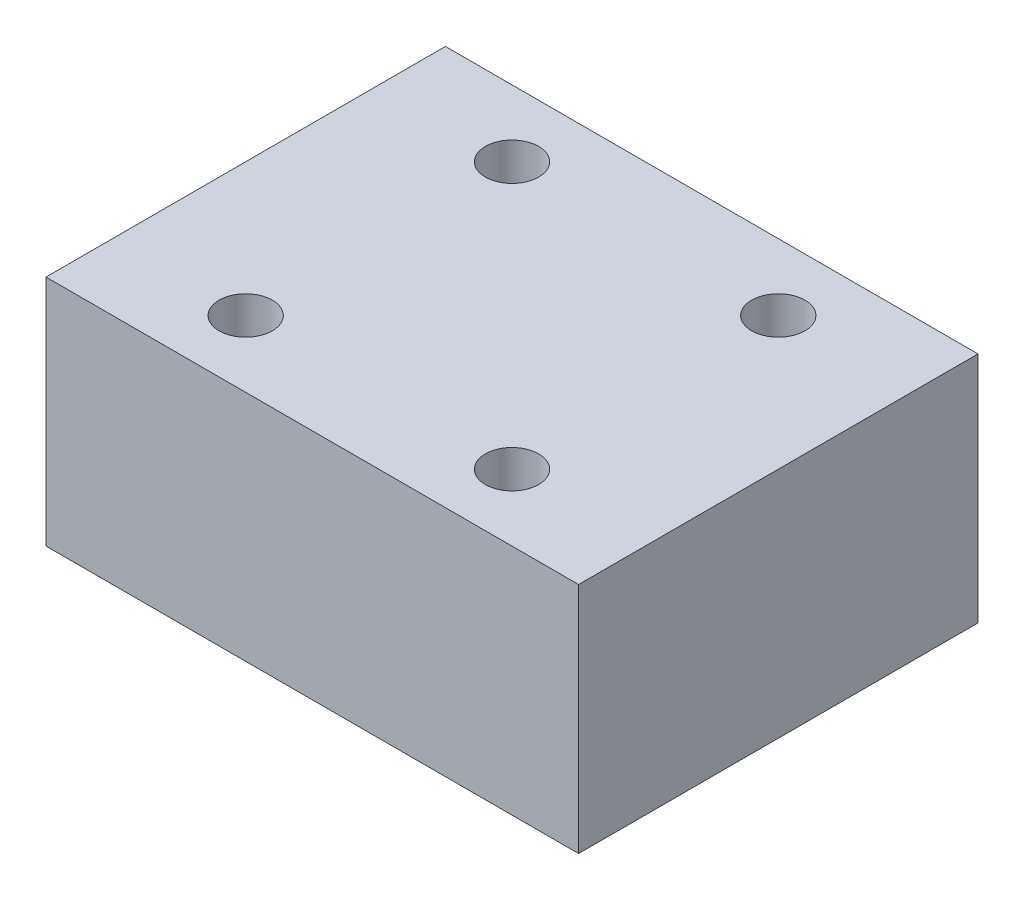
ISO-10303-21;
HEADER;
FILE_DESCRIPTION(('STEP AP214'),'2;1');
FILE_NAME('part.step','',(''),(''),'','','');
FILE_SCHEMA(('AUTOMOTIVE_DESIGN { 1 0 10303 214 1 1 1 1 }'));
ENDSEC;
DATA;
#1=APPLICATION_CONTEXT('core data for automotive mechanical design processes');
#2=APPLICATION_PROTOCOL_DEFINITION('international standard','automotive_design',2000,#1);
#3=PRODUCT_CONTEXT('',#1,'mechanical');
#4=PRODUCT('Part','Part','',(#3));
#5=PRODUCT_RELATED_PRODUCT_CATEGORY('part','',(#4));
#6=PRODUCT_DEFINITION_FORMATION('','',#4);
#7=PRODUCT_DEFINITION_CONTEXT('part definition',#1,'design');
#8=PRODUCT_DEFINITION('design','',#6,#7);
#9=PRODUCT_DEFINITION_SHAPE('','',#8);
#10=(LENGTH_UNIT() NAMED_UNIT(*) SI_UNIT(.MILLI.,.METRE.));
#11=(NAMED_UNIT(*) PLANE_ANGLE_UNIT() SI_UNIT($,.RADIAN.));
#12=(NAMED_UNIT(*) SI_UNIT($,.STERADIAN.) SOLID_ANGLE_UNIT());
#13=UNCERTAINTY_MEASURE_WITH_UNIT(LENGTH_MEASURE(1.E-05),#10,'distance_accuracy_value','');
#14=(GEOMETRIC_REPRESENTATION_CONTEXT(3) GLOBAL_UNCERTAINTY_ASSIGNED_CONTEXT((#13)) GLOBAL_UNIT_ASSIGNED_CONTEXT((#10,
#11,#12)) REPRESENTATION_CONTEXT('',''));
#15=CARTESIAN_POINT('',(0.,0.,0.));
#16=DIRECTION('',(0.,0.,1.));
#17=DIRECTION('',(1.,0.,0.));
#18=AXIS2_PLACEMENT_3D('',#15,#16,#17);
#19=CARTESIAN_POINT('',(-50.8,22.225,38.1));
#20=DIRECTION('',(1.,0.,0.));
#21=DIRECTION('',(0.,1.,0.));
#22=AXIS2_PLACEMENT_3D('',#19,#20,#21);
#23=PLANE('',#22);
#24=DIRECTION('',(0.,-1.,0.));
#25=VECTOR('',#24,1.);
#26=CARTESIAN_POINT('',(-50.8,22.225,-38.1));
#27=LINE('',#26,#25);
#28=CARTESIAN_POINT('',(-50.8,22.225,-38.1));
#29=VERTEX_POINT('',#28);
#30=CARTESIAN_POINT('',(-50.8,-22.225,-38.1));
#31=VERTEX_POINT('',#30);
#32=EDGE_CURVE('E95',#29,#31,#27,.T.);
#33=ORIENTED_EDGE('',*,*,#32,.T.);
#34=DIRECTION('',(0.,0.,-1.));
#35=VECTOR('',#34,1.);
#36=CARTESIAN_POINT('',(-50.8,-22.225,38.1));
#37=LINE('',#36,#35);
#38=CARTESIAN_POINT('',(-50.8,-22.225,38.1));
#39=VERTEX_POINT('',#38);
#40=EDGE_CURVE('E11',#39,#31,#37,.T.);
#41=ORIENTED_EDGE('',*,*,#40,.F.);
#42=DIRECTION('',(0.,-1.,0.));
#43=VECTOR('',#42,1.);
#44=CARTESIAN_POINT('',(-50.8,22.225,38.1));
#45=LINE('',#44,#43);
#46=CARTESIAN_POINT('',(-50.8,22.225,38.1));
#47=VERTEX_POINT('',#46);
#48=EDGE_CURVE('E83',#47,#39,#45,.T.);
#49=ORIENTED_EDGE('',*,*,#48,.F.);
#50=DIRECTION('',(0.,0.,-1.));
#51=VECTOR('',#50,1.);
#52=CARTESIAN_POINT('',(-50.8,22.225,38.1));
#53=LINE('',#52,#51);
#54=EDGE_CURVE('E91',#47,#29,#53,.T.);
#55=ORIENTED_EDGE('',*,*,#54,.T.);
#56=EDGE_LOOP('',(#33,#41,#49,#55));
#57=FACE_BOUND('',#56,.T.);
#58=ADVANCED_FACE('F32',(#57),#23,.F.);
#59=CARTESIAN_POINT('',(50.8,-22.225,38.1));
#60=DIRECTION('',(0.,1.,0.));
#61=DIRECTION('',(-1.,0.,0.));
#62=AXIS2_PLACEMENT_3D('',#59,#60,#61);
#63=PLANE('',#62);
#64=CARTESIAN_POINT('',(-25.4,-22.2250000000001,-25.4));
#65=DIRECTION('',(0.,1.,0.));
#66=DIRECTION('',(0.,0.,1.));
#67=AXIS2_PLACEMENT_3D('',#64,#65,#66);
#68=CIRCLE('',#67,5.07999999999999);
#69=CARTESIAN_POINT('',(-25.4,-22.2250000000001,-20.32));
#70=VERTEX_POINT('',#69);
#71=EDGE_CURVE('E126',#70,#70,#68,.T.);
#72=ORIENTED_EDGE('',*,*,#71,.T.);
#73=EDGE_LOOP('',(#72));
#74=FACE_BOUND('',#73,.T.);
#75=CARTESIAN_POINT('',(-25.4,-22.2250000000001,25.4));
#76=DIRECTION('',(0.,1.,0.));
#77=DIRECTION('',(0.,0.,1.));
#78=AXIS2_PLACEMENT_3D('',#75,#76,#77);
#79=CIRCLE('',#78,5.07999999999999);
#80=CARTESIAN_POINT('',(-25.4,-22.2250000000001,30.48));
#81=VERTEX_POINT('',#80);
#82=EDGE_CURVE('E120',#81,#81,#79,.T.);
#83=ORIENTED_EDGE('',*,*,#82,.T.);
#84=EDGE_LOOP('',(#83));
#85=FACE_BOUND('',#84,.T.);
#86=CARTESIAN_POINT('',(25.4,-22.225,25.4));
#87=DIRECTION('',(0.,1.,0.));
#88=DIRECTION('',(0.,0.,1.));
#89=AXIS2_PLACEMENT_3D('',#86,#87,#88);
#90=CIRCLE('',#89,5.07999999999999);
#91=CARTESIAN_POINT('',(25.4,-22.225,30.48));
#92=VERTEX_POINT('',#91);
#93=EDGE_CURVE('E114',#92,#92,#90,.T.);
#94=ORIENTED_EDGE('',*,*,#93,.T.);
#95=EDGE_LOOP('',(#94));
#96=FACE_BOUND('',#95,.T.);
#97=CARTESIAN_POINT('',(25.4,-22.225,-25.4));
#98=DIRECTION('',(0.,1.,0.));
#99=DIRECTION('',(0.,0.,1.));
#100=AXIS2_PLACEMENT_3D('',#97,#98,#99);
#101=CIRCLE('',#100,5.07999999999999);
#102=CARTESIAN_POINT('',(25.4,-22.225,-20.32));
#103=VERTEX_POINT('',#102);
#104=EDGE_CURVE('E98',#103,#103,#101,.T.);
#105=ORIENTED_EDGE('',*,*,#104,.T.);
#106=EDGE_LOOP('',(#105));
#107=FACE_BOUND('',#106,.T.);
#108=DIRECTION('',(1.,0.,0.));
#109=VECTOR('',#108,1.);
#110=CARTESIAN_POINT('',(50.8,-22.225,-38.1));
#111=LINE('',#110,#109);
#112=CARTESIAN_POINT('',(50.8,-22.225,-38.1));
#113=VERTEX_POINT('',#112);
#114=EDGE_CURVE('E87',#31,#113,#111,.T.);
#115=ORIENTED_EDGE('',*,*,#114,.T.);
#116=DIRECTION('',(0.,0.,-1.));
#117=VECTOR('',#116,1.);
#118=CARTESIAN_POINT('',(50.8,-22.225,38.1));
#119=LINE('',#118,#117);
#120=CARTESIAN_POINT('',(50.8,-22.225,38.1));
#121=VERTEX_POINT('',#120);
#122=EDGE_CURVE('E40',#121,#113,#119,.T.);
#123=ORIENTED_EDGE('',*,*,#122,.F.);
#124=DIRECTION('',(1.,0.,0.));
#125=VECTOR('',#124,1.);
#126=CARTESIAN_POINT('',(50.8,-22.225,38.1));
#127=LINE('',#126,#125);
#128=EDGE_CURVE('E78',#39,#121,#127,.T.);
#129=ORIENTED_EDGE('',*,*,#128,.F.);
#130=ORIENTED_EDGE('',*,*,#40,.T.);
#131=EDGE_LOOP('',(#115,#123,#129,#130));
#132=FACE_BOUND('',#131,.T.);
#133=ADVANCED_FACE('F86',(#74,#85,#96,#107,#132),#63,.F.);
#134=CARTESIAN_POINT('',(50.8,22.225,38.1));
#135=DIRECTION('',(-1.,0.,0.));
#136=DIRECTION('',(0.,-1.,0.));
#137=AXIS2_PLACEMENT_3D('',#134,#135,#136);
#138=PLANE('',#137);
#139=DIRECTION('',(0.,1.,0.));
#140=VECTOR('',#139,1.);
#141=CARTESIAN_POINT('',(50.8,22.225,-38.1));
#142=LINE('',#141,#140);
#143=CARTESIAN_POINT('',(50.8,22.225,-38.1));
#144=VERTEX_POINT('',#143);
#145=EDGE_CURVE('E65',#113,#144,#142,.T.);
#146=ORIENTED_EDGE('',*,*,#145,.T.);
#147=DIRECTION('',(0.,0.,-1.));
#148=VECTOR('',#147,1.);
#149=CARTESIAN_POINT('',(50.8,22.225,38.1));
#150=LINE('',#149,#148);
#151=CARTESIAN_POINT('',(50.8,22.225,38.1));
#152=VERTEX_POINT('',#151);
#153=EDGE_CURVE('E88',#152,#144,#150,.T.);
#154=ORIENTED_EDGE('',*,*,#153,.F.);
#155=DIRECTION('',(0.,1.,0.));
#156=VECTOR('',#155,1.);
#157=CARTESIAN_POINT('',(50.8,22.225,38.1));
#158=LINE('',#157,#156);
#159=EDGE_CURVE('E81',#121,#152,#158,.T.);
#160=ORIENTED_EDGE('',*,*,#159,.F.);
#161=ORIENTED_EDGE('',*,*,#122,.T.);
#162=EDGE_LOOP('',(#146,#154,#160,#161));
#163=FACE_BOUND('',#162,.T.);
#164=ADVANCED_FACE('F89',(#163),#138,.F.);
#165=CARTESIAN_POINT('',(50.8,22.225,38.1));
#166=DIRECTION('',(0.,-1.,0.));
#167=DIRECTION('',(1.,0.,0.));
#168=AXIS2_PLACEMENT_3D('',#165,#166,#167);
#169=PLANE('',#168);
#170=CARTESIAN_POINT('',(-25.4,22.225,-25.4));
#171=DIRECTION('',(0.,1.,0.));
#172=DIRECTION('',(0.,0.,1.));
#173=AXIS2_PLACEMENT_3D('',#170,#171,#172);
#174=CIRCLE('',#173,5.07999999999999);
#175=CARTESIAN_POINT('',(-25.4,22.225,-20.32));
#176=VERTEX_POINT('',#175);
#177=EDGE_CURVE('E129',#176,#176,#174,.T.);
#178=ORIENTED_EDGE('',*,*,#177,.F.);
#179=EDGE_LOOP('',(#178));
#180=FACE_BOUND('',#179,.T.);
#181=CARTESIAN_POINT('',(-25.4,22.225,25.4));
#182=DIRECTION('',(0.,1.,0.));
#183=DIRECTION('',(0.,0.,1.));
#184=AXIS2_PLACEMENT_3D('',#181,#182,#183);
#185=CIRCLE('',#184,5.07999999999999);
#186=CARTESIAN_POINT('',(-25.4,22.225,30.48));
#187=VERTEX_POINT('',#186);
#188=EDGE_CURVE('E123',#187,#187,#185,.T.);
#189=ORIENTED_EDGE('',*,*,#188,.F.);
#190=EDGE_LOOP('',(#189));
#191=FACE_BOUND('',#190,.T.);
#192=CARTESIAN_POINT('',(25.4,22.225,25.4));
#193=DIRECTION('',(0.,1.,0.));
#194=DIRECTION('',(0.,0.,1.));
#195=AXIS2_PLACEMENT_3D('',#192,#193,#194);
#196=CIRCLE('',#195,5.07999999999999);
#197=CARTESIAN_POINT('',(25.4,22.225,30.48));
#198=VERTEX_POINT('',#197);
#199=EDGE_CURVE('E117',#198,#198,#196,.T.);
#200=ORIENTED_EDGE('',*,*,#199,.F.);
#201=EDGE_LOOP('',(#200));
#202=FACE_BOUND('',#201,.T.);
#203=CARTESIAN_POINT('',(25.4,22.225,-25.4));
#204=DIRECTION('',(0.,1.,0.));
#205=DIRECTION('',(0.,0.,1.));
#206=AXIS2_PLACEMENT_3D('',#203,#204,#205);
#207=CIRCLE('',#206,5.07999999999999);
#208=CARTESIAN_POINT('',(25.4,22.225,-20.32));
#209=VERTEX_POINT('',#208);
#210=EDGE_CURVE('E111',#209,#209,#207,.T.);
#211=ORIENTED_EDGE('',*,*,#210,.F.);
#212=EDGE_LOOP('',(#211));
#213=FACE_BOUND('',#212,.T.);
#214=DIRECTION('',(-1.,0.,0.));
#215=VECTOR('',#214,1.);
#216=CARTESIAN_POINT('',(50.8,22.225,-38.1));
#217=LINE('',#216,#215);
#218=EDGE_CURVE('E71',#144,#29,#217,.T.);
#219=ORIENTED_EDGE('',*,*,#218,.T.);
#220=ORIENTED_EDGE('',*,*,#54,.F.);
#221=DIRECTION('',(-1.,0.,0.));
#222=VECTOR('',#221,1.);
#223=CARTESIAN_POINT('',(50.8,22.225,38.1));
#224=LINE('',#223,#222);
#225=EDGE_CURVE('E48',#152,#47,#224,.T.);
#226=ORIENTED_EDGE('',*,*,#225,.F.);
#227=ORIENTED_EDGE('',*,*,#153,.T.);
#228=EDGE_LOOP('',(#219,#220,#226,#227));
#229=FACE_BOUND('',#228,.T.);
#230=ADVANCED_FACE('F103',(#180,#191,#202,#213,#229),#169,.F.);
#231=CARTESIAN_POINT('',(0.,0.,38.1));
#232=DIRECTION('',(0.,0.,-1.));
#233=DIRECTION('',(-1.,0.,0.));
#234=AXIS2_PLACEMENT_3D('',#231,#232,#233);
#235=PLANE('',#234);
#236=ORIENTED_EDGE('',*,*,#48,.T.);
#237=ORIENTED_EDGE('',*,*,#128,.T.);
#238=ORIENTED_EDGE('',*,*,#159,.T.);
#239=ORIENTED_EDGE('',*,*,#225,.T.);
#240=EDGE_LOOP('',(#236,#237,#238,#239));
#241=FACE_BOUND('',#240,.T.);
#242=ADVANCED_FACE('F79',(#241),#235,.F.);
#243=CARTESIAN_POINT('',(0.,0.,-38.1));
#244=DIRECTION('',(0.,0.,-1.));
#245=DIRECTION('',(-1.,0.,0.));
#246=AXIS2_PLACEMENT_3D('',#243,#244,#245);
#247=PLANE('',#246);
#248=ORIENTED_EDGE('',*,*,#32,.F.);
#249=ORIENTED_EDGE('',*,*,#218,.F.);
#250=ORIENTED_EDGE('',*,*,#145,.F.);
#251=ORIENTED_EDGE('',*,*,#114,.F.);
#252=EDGE_LOOP('',(#248,#249,#250,#251));
#253=FACE_BOUND('',#252,.T.);
#254=ADVANCED_FACE('F106',(#253),#247,.T.);
#255=CARTESIAN_POINT('',(25.4,22.225,-25.4));
#256=DIRECTION('',(0.,1.,0.));
#257=DIRECTION('',(0.,0.,1.));
#258=AXIS2_PLACEMENT_3D('',#255,#256,#257);
#259=CYLINDRICAL_SURFACE('',#258,5.07999999999999);
#260=ORIENTED_EDGE('',*,*,#104,.F.);
#261=EDGE_LOOP('',(#260));
#262=FACE_BOUND('',#261,.T.);
#263=ORIENTED_EDGE('',*,*,#210,.T.);
#264=EDGE_LOOP('',(#263));
#265=FACE_BOUND('',#264,.T.);
#266=ADVANCED_FACE('F144',(#262,#265),#259,.F.);
#267=CARTESIAN_POINT('',(25.4,22.225,25.4));
#268=DIRECTION('',(0.,1.,0.));
#269=DIRECTION('',(0.,0.,1.));
#270=AXIS2_PLACEMENT_3D('',#267,#268,#269);
#271=CYLINDRICAL_SURFACE('',#270,5.07999999999999);
#272=ORIENTED_EDGE('',*,*,#93,.F.);
#273=EDGE_LOOP('',(#272));
#274=FACE_BOUND('',#273,.T.);
#275=ORIENTED_EDGE('',*,*,#199,.T.);
#276=EDGE_LOOP('',(#275));
#277=FACE_BOUND('',#276,.T.);
#278=ADVANCED_FACE('F146',(#274,#277),#271,.F.);
#279=CARTESIAN_POINT('',(-25.4,22.225,25.4));
#280=DIRECTION('',(0.,1.,0.));
#281=DIRECTION('',(0.,0.,1.));
#282=AXIS2_PLACEMENT_3D('',#279,#280,#281);
#283=CYLINDRICAL_SURFACE('',#282,5.07999999999999);
#284=ORIENTED_EDGE('',*,*,#82,.F.);
#285=EDGE_LOOP('',(#284));
#286=FACE_BOUND('',#285,.T.);
#287=ORIENTED_EDGE('',*,*,#188,.T.);
#288=EDGE_LOOP('',(#287));
#289=FACE_BOUND('',#288,.T.);
#290=ADVANCED_FACE('F153',(#286,#289),#283,.F.);
#291=CARTESIAN_POINT('',(-25.4,22.225,-25.4));
#292=DIRECTION('',(0.,1.,0.));
#293=DIRECTION('',(0.,0.,1.));
#294=AXIS2_PLACEMENT_3D('',#291,#292,#293);
#295=CYLINDRICAL_SURFACE('',#294,5.07999999999999);
#296=ORIENTED_EDGE('',*,*,#71,.F.);
#297=EDGE_LOOP('',(#296));
#298=FACE_BOUND('',#297,.T.);
#299=ORIENTED_EDGE('',*,*,#177,.T.);
#300=EDGE_LOOP('',(#299));
#301=FACE_BOUND('',#300,.T.);
#302=ADVANCED_FACE('F133',(#298,#301),#295,.F.);
#303=CLOSED_SHELL('',(#58,#133,#164,#230,#242,#254,#266,#278,#290,#302));
#304=MANIFOLD_SOLID_BREP('B2',#303);
#305=ADVANCED_BREP_SHAPE_REPRESENTATION('',(#18,#304),#14);
#306=SHAPE_DEFINITION_REPRESENTATION(#9,#305);
ENDSEC;
END-ISO-10303-21;
